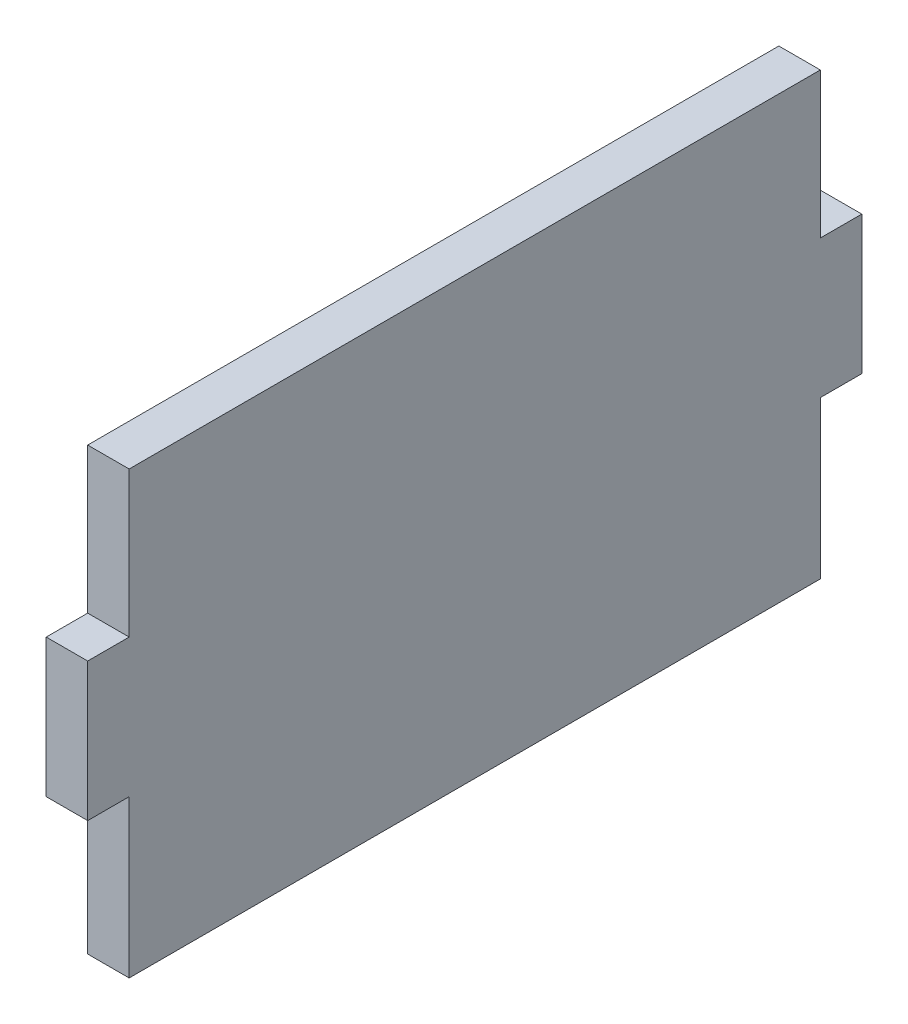
ISO-10303-21;
HEADER;
FILE_DESCRIPTION(('STEP AP214'),'2;1');
FILE_NAME('part.step','',(''),(''),'','','');
FILE_SCHEMA(('AUTOMOTIVE_DESIGN { 1 0 10303 214 1 1 1 1 }'));
ENDSEC;
DATA;
#1=APPLICATION_CONTEXT('core data for automotive mechanical design processes');
#2=APPLICATION_PROTOCOL_DEFINITION('international standard','automotive_design',2000,#1);
#3=PRODUCT_CONTEXT('',#1,'mechanical');
#4=PRODUCT('Part','Part','',(#3));
#5=PRODUCT_RELATED_PRODUCT_CATEGORY('part','',(#4));
#6=PRODUCT_DEFINITION_FORMATION('','',#4);
#7=PRODUCT_DEFINITION_CONTEXT('part definition',#1,'design');
#8=PRODUCT_DEFINITION('design','',#6,#7);
#9=PRODUCT_DEFINITION_SHAPE('','',#8);
#10=(LENGTH_UNIT() NAMED_UNIT(*) SI_UNIT(.MILLI.,.METRE.));
#11=(NAMED_UNIT(*) PLANE_ANGLE_UNIT() SI_UNIT($,.RADIAN.));
#12=(NAMED_UNIT(*) SI_UNIT($,.STERADIAN.) SOLID_ANGLE_UNIT());
#13=UNCERTAINTY_MEASURE_WITH_UNIT(LENGTH_MEASURE(1.E-05),#10,'distance_accuracy_value','');
#14=(GEOMETRIC_REPRESENTATION_CONTEXT(3) GLOBAL_UNCERTAINTY_ASSIGNED_CONTEXT((#13)) GLOBAL_UNIT_ASSIGNED_CONTEXT((#10,
#11,#12)) REPRESENTATION_CONTEXT('',''));
#15=CARTESIAN_POINT('',(0.,0.,0.));
#16=DIRECTION('',(0.,0.,1.));
#17=DIRECTION('',(1.,0.,0.));
#18=AXIS2_PLACEMENT_3D('',#15,#16,#17);
#19=CARTESIAN_POINT('',(3.,0.,0.));
#20=DIRECTION('',(0.,0.,-1.));
#21=DIRECTION('',(0.,1.,0.));
#22=AXIS2_PLACEMENT_3D('',#19,#20,#21);
#23=PLANE('',#22);
#24=DIRECTION('',(0.,-1.,0.));
#25=VECTOR('',#24,1.);
#26=CARTESIAN_POINT('',(0.,0.,0.));
#27=LINE('',#26,#25);
#28=CARTESIAN_POINT('',(0.,11.36,0.));
#29=VERTEX_POINT('',#28);
#30=CARTESIAN_POINT('',(0.,0.,0.));
#31=VERTEX_POINT('',#30);
#32=EDGE_CURVE('E159',#29,#31,#27,.T.);
#33=ORIENTED_EDGE('',*,*,#32,.T.);
#34=DIRECTION('',(-1.,0.,0.));
#35=VECTOR('',#34,1.);
#36=CARTESIAN_POINT('',(3.,0.,0.));
#37=LINE('',#36,#35);
#38=CARTESIAN_POINT('',(3.,0.,0.));
#39=VERTEX_POINT('',#38);
#40=EDGE_CURVE('E11',#39,#31,#37,.T.);
#41=ORIENTED_EDGE('',*,*,#40,.F.);
#42=DIRECTION('',(0.,-1.,0.));
#43=VECTOR('',#42,1.);
#44=CARTESIAN_POINT('',(3.,0.,0.));
#45=LINE('',#44,#43);
#46=CARTESIAN_POINT('',(3.,11.36,0.));
#47=VERTEX_POINT('',#46);
#48=EDGE_CURVE('E181',#47,#39,#45,.T.);
#49=ORIENTED_EDGE('',*,*,#48,.F.);
#50=DIRECTION('',(-1.,0.,0.));
#51=VECTOR('',#50,1.);
#52=CARTESIAN_POINT('',(3.,11.36,0.));
#53=LINE('',#52,#51);
#54=EDGE_CURVE('E155',#47,#29,#53,.T.);
#55=ORIENTED_EDGE('',*,*,#54,.T.);
#56=EDGE_LOOP('',(#33,#41,#49,#55));
#57=FACE_BOUND('',#56,.T.);
#58=ADVANCED_FACE('F39',(#57),#23,.F.);
#59=CARTESIAN_POINT('',(3.,0.,0.));
#60=DIRECTION('',(0.,1.,0.));
#61=DIRECTION('',(0.,0.,1.));
#62=AXIS2_PLACEMENT_3D('',#59,#60,#61);
#63=PLANE('',#62);
#64=DIRECTION('',(0.,0.,-1.));
#65=VECTOR('',#64,1.);
#66=CARTESIAN_POINT('',(0.,0.,0.));
#67=LINE('',#66,#65);
#68=CARTESIAN_POINT('',(0.,0.,-50.));
#69=VERTEX_POINT('',#68);
#70=EDGE_CURVE('E162',#31,#69,#67,.T.);
#71=ORIENTED_EDGE('',*,*,#70,.T.);
#72=DIRECTION('',(-1.,0.,0.));
#73=VECTOR('',#72,1.);
#74=CARTESIAN_POINT('',(3.,0.,-50.));
#75=LINE('',#74,#73);
#76=CARTESIAN_POINT('',(3.,0.,-50.));
#77=VERTEX_POINT('',#76);
#78=EDGE_CURVE('E47',#77,#69,#75,.T.);
#79=ORIENTED_EDGE('',*,*,#78,.F.);
#80=DIRECTION('',(0.,0.,-1.));
#81=VECTOR('',#80,1.);
#82=CARTESIAN_POINT('',(3.,0.,0.));
#83=LINE('',#82,#81);
#84=EDGE_CURVE('E110',#39,#77,#83,.T.);
#85=ORIENTED_EDGE('',*,*,#84,.F.);
#86=ORIENTED_EDGE('',*,*,#40,.T.);
#87=EDGE_LOOP('',(#71,#79,#85,#86));
#88=FACE_BOUND('',#87,.T.);
#89=ADVANCED_FACE('F259',(#88),#63,.F.);
#90=CARTESIAN_POINT('',(3.,0.,-50.));
#91=DIRECTION('',(0.,0.,1.));
#92=DIRECTION('',(1.,0.,0.));
#93=AXIS2_PLACEMENT_3D('',#90,#91,#92);
#94=PLANE('',#93);
#95=DIRECTION('',(0.,1.,0.));
#96=VECTOR('',#95,1.);
#97=CARTESIAN_POINT('',(0.,0.,-50.));
#98=LINE('',#97,#96);
#99=CARTESIAN_POINT('',(0.,11.36,-50.));
#100=VERTEX_POINT('',#99);
#101=EDGE_CURVE('E164',#69,#100,#98,.T.);
#102=ORIENTED_EDGE('',*,*,#101,.T.);
#103=DIRECTION('',(-1.,0.,0.));
#104=VECTOR('',#103,1.);
#105=CARTESIAN_POINT('',(3.,11.36,-50.));
#106=LINE('',#105,#104);
#107=CARTESIAN_POINT('',(3.,11.36,-50.));
#108=VERTEX_POINT('',#107);
#109=EDGE_CURVE('E200',#108,#100,#106,.T.);
#110=ORIENTED_EDGE('',*,*,#109,.F.);
#111=DIRECTION('',(0.,1.,0.));
#112=VECTOR('',#111,1.);
#113=CARTESIAN_POINT('',(3.,0.,-50.));
#114=LINE('',#113,#112);
#115=EDGE_CURVE('E208',#77,#108,#114,.T.);
#116=ORIENTED_EDGE('',*,*,#115,.F.);
#117=ORIENTED_EDGE('',*,*,#78,.T.);
#118=EDGE_LOOP('',(#102,#110,#116,#117));
#119=FACE_BOUND('',#118,.T.);
#120=ADVANCED_FACE('F206',(#119),#94,.F.);
#121=CARTESIAN_POINT('',(3.,11.36,-50.));
#122=DIRECTION('',(0.,1.,0.));
#123=DIRECTION('',(0.,0.,1.));
#124=AXIS2_PLACEMENT_3D('',#121,#122,#123);
#125=PLANE('',#124);
#126=DIRECTION('',(0.,0.,-1.));
#127=VECTOR('',#126,1.);
#128=CARTESIAN_POINT('',(0.,11.36,-50.));
#129=LINE('',#128,#127);
#130=CARTESIAN_POINT('',(0.,11.36,-53.));
#131=VERTEX_POINT('',#130);
#132=EDGE_CURVE('E166',#100,#131,#129,.T.);
#133=ORIENTED_EDGE('',*,*,#132,.T.);
#134=DIRECTION('',(-1.,0.,0.));
#135=VECTOR('',#134,1.);
#136=CARTESIAN_POINT('',(3.,11.36,-53.));
#137=LINE('',#136,#135);
#138=CARTESIAN_POINT('',(3.,11.36,-53.));
#139=VERTEX_POINT('',#138);
#140=EDGE_CURVE('E197',#139,#131,#137,.T.);
#141=ORIENTED_EDGE('',*,*,#140,.F.);
#142=DIRECTION('',(0.,0.,-1.));
#143=VECTOR('',#142,1.);
#144=CARTESIAN_POINT('',(3.,11.36,-50.));
#145=LINE('',#144,#143);
#146=EDGE_CURVE('E226',#108,#139,#145,.T.);
#147=ORIENTED_EDGE('',*,*,#146,.F.);
#148=ORIENTED_EDGE('',*,*,#109,.T.);
#149=EDGE_LOOP('',(#133,#141,#147,#148));
#150=FACE_BOUND('',#149,.T.);
#151=ADVANCED_FACE('F217',(#150),#125,.F.);
#152=CARTESIAN_POINT('',(3.,21.36,-53.));
#153=DIRECTION('',(0.,0.,1.));
#154=DIRECTION('',(0.,-1.,0.));
#155=AXIS2_PLACEMENT_3D('',#152,#153,#154);
#156=PLANE('',#155);
#157=DIRECTION('',(0.,1.,0.));
#158=VECTOR('',#157,1.);
#159=CARTESIAN_POINT('',(0.,21.36,-53.));
#160=LINE('',#159,#158);
#161=CARTESIAN_POINT('',(0.,21.36,-53.));
#162=VERTEX_POINT('',#161);
#163=EDGE_CURVE('E168',#131,#162,#160,.T.);
#164=ORIENTED_EDGE('',*,*,#163,.T.);
#165=DIRECTION('',(-1.,0.,0.));
#166=VECTOR('',#165,1.);
#167=CARTESIAN_POINT('',(3.,21.36,-53.));
#168=LINE('',#167,#166);
#169=CARTESIAN_POINT('',(3.,21.36,-53.));
#170=VERTEX_POINT('',#169);
#171=EDGE_CURVE('E194',#170,#162,#168,.T.);
#172=ORIENTED_EDGE('',*,*,#171,.F.);
#173=DIRECTION('',(0.,1.,0.));
#174=VECTOR('',#173,1.);
#175=CARTESIAN_POINT('',(3.,21.36,-53.));
#176=LINE('',#175,#174);
#177=EDGE_CURVE('E223',#139,#170,#176,.T.);
#178=ORIENTED_EDGE('',*,*,#177,.F.);
#179=ORIENTED_EDGE('',*,*,#140,.T.);
#180=EDGE_LOOP('',(#164,#172,#178,#179));
#181=FACE_BOUND('',#180,.T.);
#182=ADVANCED_FACE('F221',(#181),#156,.F.);
#183=CARTESIAN_POINT('',(3.,21.36,-50.));
#184=DIRECTION('',(0.,-1.,0.));
#185=DIRECTION('',(0.,0.,-1.));
#186=AXIS2_PLACEMENT_3D('',#183,#184,#185);
#187=PLANE('',#186);
#188=DIRECTION('',(0.,0.,1.));
#189=VECTOR('',#188,1.);
#190=CARTESIAN_POINT('',(0.,21.36,-50.));
#191=LINE('',#190,#189);
#192=CARTESIAN_POINT('',(0.,21.36,-50.));
#193=VERTEX_POINT('',#192);
#194=EDGE_CURVE('E170',#162,#193,#191,.T.);
#195=ORIENTED_EDGE('',*,*,#194,.T.);
#196=DIRECTION('',(-1.,0.,0.));
#197=VECTOR('',#196,1.);
#198=CARTESIAN_POINT('',(3.,21.36,-50.));
#199=LINE('',#198,#197);
#200=CARTESIAN_POINT('',(3.,21.36,-50.));
#201=VERTEX_POINT('',#200);
#202=EDGE_CURVE('E191',#201,#193,#199,.T.);
#203=ORIENTED_EDGE('',*,*,#202,.F.);
#204=DIRECTION('',(0.,0.,1.));
#205=VECTOR('',#204,1.);
#206=CARTESIAN_POINT('',(3.,21.36,-50.));
#207=LINE('',#206,#205);
#208=EDGE_CURVE('E225',#170,#201,#207,.T.);
#209=ORIENTED_EDGE('',*,*,#208,.F.);
#210=ORIENTED_EDGE('',*,*,#171,.T.);
#211=EDGE_LOOP('',(#195,#203,#209,#210));
#212=FACE_BOUND('',#211,.T.);
#213=ADVANCED_FACE('F272',(#212),#187,.F.);
#214=CARTESIAN_POINT('',(3.,21.36,-50.));
#215=DIRECTION('',(0.,0.,1.));
#216=DIRECTION('',(1.,0.,0.));
#217=AXIS2_PLACEMENT_3D('',#214,#215,#216);
#218=PLANE('',#217);
#219=DIRECTION('',(0.,1.,0.));
#220=VECTOR('',#219,1.);
#221=CARTESIAN_POINT('',(0.,21.36,-50.));
#222=LINE('',#221,#220);
#223=CARTESIAN_POINT('',(0.,31.89,-50.));
#224=VERTEX_POINT('',#223);
#225=EDGE_CURVE('E172',#193,#224,#222,.T.);
#226=ORIENTED_EDGE('',*,*,#225,.T.);
#227=DIRECTION('',(-1.,0.,0.));
#228=VECTOR('',#227,1.);
#229=CARTESIAN_POINT('',(3.,31.89,-50.));
#230=LINE('',#229,#228);
#231=CARTESIAN_POINT('',(3.,31.89,-50.));
#232=VERTEX_POINT('',#231);
#233=EDGE_CURVE('E188',#232,#224,#230,.T.);
#234=ORIENTED_EDGE('',*,*,#233,.F.);
#235=DIRECTION('',(0.,1.,0.));
#236=VECTOR('',#235,1.);
#237=CARTESIAN_POINT('',(3.,21.36,-50.));
#238=LINE('',#237,#236);
#239=EDGE_CURVE('E228',#201,#232,#238,.T.);
#240=ORIENTED_EDGE('',*,*,#239,.F.);
#241=ORIENTED_EDGE('',*,*,#202,.T.);
#242=EDGE_LOOP('',(#226,#234,#240,#241));
#243=FACE_BOUND('',#242,.T.);
#244=ADVANCED_FACE('F275',(#243),#218,.F.);
#245=CARTESIAN_POINT('',(3.,31.89,0.));
#246=DIRECTION('',(0.,-1.,0.));
#247=DIRECTION('',(0.,0.,-1.));
#248=AXIS2_PLACEMENT_3D('',#245,#246,#247);
#249=PLANE('',#248);
#250=DIRECTION('',(0.,0.,1.));
#251=VECTOR('',#250,1.);
#252=CARTESIAN_POINT('',(0.,31.89,0.));
#253=LINE('',#252,#251);
#254=CARTESIAN_POINT('',(0.,31.89,0.));
#255=VERTEX_POINT('',#254);
#256=EDGE_CURVE('E174',#224,#255,#253,.T.);
#257=ORIENTED_EDGE('',*,*,#256,.T.);
#258=DIRECTION('',(-1.,0.,0.));
#259=VECTOR('',#258,1.);
#260=CARTESIAN_POINT('',(3.,31.89,0.));
#261=LINE('',#260,#259);
#262=CARTESIAN_POINT('',(3.,31.89,0.));
#263=VERTEX_POINT('',#262);
#264=EDGE_CURVE('E185',#263,#255,#261,.T.);
#265=ORIENTED_EDGE('',*,*,#264,.F.);
#266=DIRECTION('',(0.,0.,1.));
#267=VECTOR('',#266,1.);
#268=CARTESIAN_POINT('',(3.,31.89,0.));
#269=LINE('',#268,#267);
#270=EDGE_CURVE('E234',#232,#263,#269,.T.);
#271=ORIENTED_EDGE('',*,*,#270,.F.);
#272=ORIENTED_EDGE('',*,*,#233,.T.);
#273=EDGE_LOOP('',(#257,#265,#271,#272));
#274=FACE_BOUND('',#273,.T.);
#275=ADVANCED_FACE('F240',(#274),#249,.F.);
#276=CARTESIAN_POINT('',(3.,21.36,0.));
#277=DIRECTION('',(0.,0.,-1.));
#278=DIRECTION('',(0.,1.,0.));
#279=AXIS2_PLACEMENT_3D('',#276,#277,#278);
#280=PLANE('',#279);
#281=DIRECTION('',(0.,-1.,0.));
#282=VECTOR('',#281,1.);
#283=CARTESIAN_POINT('',(0.,21.36,0.));
#284=LINE('',#283,#282);
#285=CARTESIAN_POINT('',(0.,21.36,0.));
#286=VERTEX_POINT('',#285);
#287=EDGE_CURVE('E176',#255,#286,#284,.T.);
#288=ORIENTED_EDGE('',*,*,#287,.T.);
#289=DIRECTION('',(-1.,0.,0.));
#290=VECTOR('',#289,1.);
#291=CARTESIAN_POINT('',(3.,21.36,0.));
#292=LINE('',#291,#290);
#293=CARTESIAN_POINT('',(3.,21.36,0.));
#294=VERTEX_POINT('',#293);
#295=EDGE_CURVE('E150',#294,#286,#292,.T.);
#296=ORIENTED_EDGE('',*,*,#295,.F.);
#297=DIRECTION('',(0.,-1.,0.));
#298=VECTOR('',#297,1.);
#299=CARTESIAN_POINT('',(3.,21.36,0.));
#300=LINE('',#299,#298);
#301=EDGE_CURVE('E141',#263,#294,#300,.T.);
#302=ORIENTED_EDGE('',*,*,#301,.F.);
#303=ORIENTED_EDGE('',*,*,#264,.T.);
#304=EDGE_LOOP('',(#288,#296,#302,#303));
#305=FACE_BOUND('',#304,.T.);
#306=ADVANCED_FACE('F244',(#305),#280,.F.);
#307=CARTESIAN_POINT('',(3.,21.36,0.));
#308=DIRECTION('',(0.,-1.,0.));
#309=DIRECTION('',(0.,0.,-1.));
#310=AXIS2_PLACEMENT_3D('',#307,#308,#309);
#311=PLANE('',#310);
#312=DIRECTION('',(0.,0.,1.));
#313=VECTOR('',#312,1.);
#314=CARTESIAN_POINT('',(0.,21.36,0.));
#315=LINE('',#314,#313);
#316=CARTESIAN_POINT('',(0.,21.36,3.));
#317=VERTEX_POINT('',#316);
#318=EDGE_CURVE('E149',#286,#317,#315,.T.);
#319=ORIENTED_EDGE('',*,*,#318,.T.);
#320=DIRECTION('',(-1.,0.,0.));
#321=VECTOR('',#320,1.);
#322=CARTESIAN_POINT('',(3.,21.36,3.));
#323=LINE('',#322,#321);
#324=CARTESIAN_POINT('',(3.,21.36,3.));
#325=VERTEX_POINT('',#324);
#326=EDGE_CURVE('E146',#325,#317,#323,.T.);
#327=ORIENTED_EDGE('',*,*,#326,.F.);
#328=DIRECTION('',(0.,0.,1.));
#329=VECTOR('',#328,1.);
#330=CARTESIAN_POINT('',(3.,21.36,0.));
#331=LINE('',#330,#329);
#332=EDGE_CURVE('E135',#294,#325,#331,.T.);
#333=ORIENTED_EDGE('',*,*,#332,.F.);
#334=ORIENTED_EDGE('',*,*,#295,.T.);
#335=EDGE_LOOP('',(#319,#327,#333,#334));
#336=FACE_BOUND('',#335,.T.);
#337=ADVANCED_FACE('F147',(#336),#311,.F.);
#338=CARTESIAN_POINT('',(3.,21.36,3.));
#339=DIRECTION('',(0.,0.,-1.));
#340=DIRECTION('',(0.,1.,0.));
#341=AXIS2_PLACEMENT_3D('',#338,#339,#340);
#342=PLANE('',#341);
#343=DIRECTION('',(0.,-1.,0.));
#344=VECTOR('',#343,1.);
#345=CARTESIAN_POINT('',(0.,21.36,3.));
#346=LINE('',#345,#344);
#347=CARTESIAN_POINT('',(0.,11.36,3.));
#348=VERTEX_POINT('',#347);
#349=EDGE_CURVE('E96',#317,#348,#346,.T.);
#350=ORIENTED_EDGE('',*,*,#349,.T.);
#351=DIRECTION('',(-1.,0.,0.));
#352=VECTOR('',#351,1.);
#353=CARTESIAN_POINT('',(3.,11.36,3.));
#354=LINE('',#353,#352);
#355=CARTESIAN_POINT('',(3.,11.36,3.));
#356=VERTEX_POINT('',#355);
#357=EDGE_CURVE('E151',#356,#348,#354,.T.);
#358=ORIENTED_EDGE('',*,*,#357,.F.);
#359=DIRECTION('',(0.,-1.,0.));
#360=VECTOR('',#359,1.);
#361=CARTESIAN_POINT('',(3.,21.36,3.));
#362=LINE('',#361,#360);
#363=EDGE_CURVE('E139',#325,#356,#362,.T.);
#364=ORIENTED_EDGE('',*,*,#363,.F.);
#365=ORIENTED_EDGE('',*,*,#326,.T.);
#366=EDGE_LOOP('',(#350,#358,#364,#365));
#367=FACE_BOUND('',#366,.T.);
#368=ADVANCED_FACE('F153',(#367),#342,.F.);
#369=CARTESIAN_POINT('',(3.,11.36,0.));
#370=DIRECTION('',(0.,1.,0.));
#371=DIRECTION('',(0.,0.,1.));
#372=AXIS2_PLACEMENT_3D('',#369,#370,#371);
#373=PLANE('',#372);
#374=DIRECTION('',(0.,0.,-1.));
#375=VECTOR('',#374,1.);
#376=CARTESIAN_POINT('',(0.,11.36,0.));
#377=LINE('',#376,#375);
#378=EDGE_CURVE('E102',#348,#29,#377,.T.);
#379=ORIENTED_EDGE('',*,*,#378,.T.);
#380=ORIENTED_EDGE('',*,*,#54,.F.);
#381=DIRECTION('',(0.,0.,-1.));
#382=VECTOR('',#381,1.);
#383=CARTESIAN_POINT('',(3.,11.36,0.));
#384=LINE('',#383,#382);
#385=EDGE_CURVE('E55',#356,#47,#384,.T.);
#386=ORIENTED_EDGE('',*,*,#385,.F.);
#387=ORIENTED_EDGE('',*,*,#357,.T.);
#388=EDGE_LOOP('',(#379,#380,#386,#387));
#389=FACE_BOUND('',#388,.T.);
#390=ADVANCED_FACE('F248',(#389),#373,.F.);
#391=CARTESIAN_POINT('',(3.,0.,0.));
#392=DIRECTION('',(1.,0.,0.));
#393=DIRECTION('',(0.,0.,-1.));
#394=AXIS2_PLACEMENT_3D('',#391,#392,#393);
#395=PLANE('',#394);
#396=ORIENTED_EDGE('',*,*,#48,.T.);
#397=ORIENTED_EDGE('',*,*,#84,.T.);
#398=ORIENTED_EDGE('',*,*,#115,.T.);
#399=ORIENTED_EDGE('',*,*,#146,.T.);
#400=ORIENTED_EDGE('',*,*,#177,.T.);
#401=ORIENTED_EDGE('',*,*,#208,.T.);
#402=ORIENTED_EDGE('',*,*,#239,.T.);
#403=ORIENTED_EDGE('',*,*,#270,.T.);
#404=ORIENTED_EDGE('',*,*,#301,.T.);
#405=ORIENTED_EDGE('',*,*,#332,.T.);
#406=ORIENTED_EDGE('',*,*,#363,.T.);
#407=ORIENTED_EDGE('',*,*,#385,.T.);
#408=EDGE_LOOP('',(#396,#397,#398,#399,#400,#401,#402,#403,#404,#405,#406,#407));
#409=FACE_BOUND('',#408,.T.);
#410=ADVANCED_FACE('F137',(#409),#395,.T.);
#411=CARTESIAN_POINT('',(0.,0.,0.));
#412=DIRECTION('',(1.,0.,0.));
#413=DIRECTION('',(0.,0.,-1.));
#414=AXIS2_PLACEMENT_3D('',#411,#412,#413);
#415=PLANE('',#414);
#416=ORIENTED_EDGE('',*,*,#32,.F.);
#417=ORIENTED_EDGE('',*,*,#378,.F.);
#418=ORIENTED_EDGE('',*,*,#349,.F.);
#419=ORIENTED_EDGE('',*,*,#318,.F.);
#420=ORIENTED_EDGE('',*,*,#287,.F.);
#421=ORIENTED_EDGE('',*,*,#256,.F.);
#422=ORIENTED_EDGE('',*,*,#225,.F.);
#423=ORIENTED_EDGE('',*,*,#194,.F.);
#424=ORIENTED_EDGE('',*,*,#163,.F.);
#425=ORIENTED_EDGE('',*,*,#132,.F.);
#426=ORIENTED_EDGE('',*,*,#101,.F.);
#427=ORIENTED_EDGE('',*,*,#70,.F.);
#428=EDGE_LOOP('',(#416,#417,#418,#419,#420,#421,#422,#423,#424,#425,#426,#427));
#429=FACE_BOUND('',#428,.T.);
#430=ADVANCED_FACE('F212',(#429),#415,.F.);
#431=CLOSED_SHELL('',(#58,#89,#120,#151,#182,#213,#244,#275,#306,#337,#368,#390,#410,#430));
#432=MANIFOLD_SOLID_BREP('B2',#431);
#433=ADVANCED_BREP_SHAPE_REPRESENTATION('',(#18,#432),#14);
#434=SHAPE_DEFINITION_REPRESENTATION(#9,#433);
ENDSEC;
END-ISO-10303-21;
